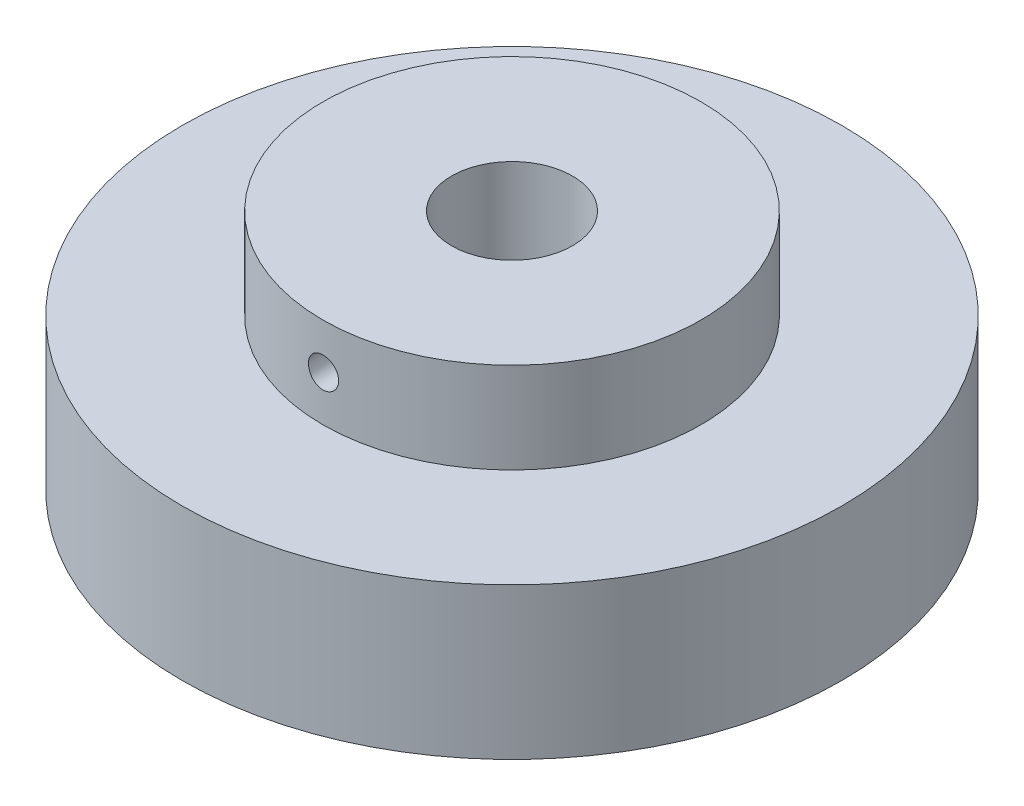
ISO-10303-21;
HEADER;
FILE_DESCRIPTION(('STEP AP214'),'2;1');
FILE_NAME('part.step','',(''),(''),'','','');
FILE_SCHEMA(('AUTOMOTIVE_DESIGN { 1 0 10303 214 1 1 1 1 }'));
ENDSEC;
DATA;
#1=APPLICATION_CONTEXT('core data for automotive mechanical design processes');
#2=APPLICATION_PROTOCOL_DEFINITION('international standard','automotive_design',2000,#1);
#3=PRODUCT_CONTEXT('',#1,'mechanical');
#4=PRODUCT('Part','Part','',(#3));
#5=PRODUCT_RELATED_PRODUCT_CATEGORY('part','',(#4));
#6=PRODUCT_DEFINITION_FORMATION('','',#4);
#7=PRODUCT_DEFINITION_CONTEXT('part definition',#1,'design');
#8=PRODUCT_DEFINITION('design','',#6,#7);
#9=PRODUCT_DEFINITION_SHAPE('','',#8);
#10=(LENGTH_UNIT() NAMED_UNIT(*) SI_UNIT(.MILLI.,.METRE.));
#11=(NAMED_UNIT(*) PLANE_ANGLE_UNIT() SI_UNIT($,.RADIAN.));
#12=(NAMED_UNIT(*) SI_UNIT($,.STERADIAN.) SOLID_ANGLE_UNIT());
#13=UNCERTAINTY_MEASURE_WITH_UNIT(LENGTH_MEASURE(1.E-05),#10,'distance_accuracy_value','');
#14=(GEOMETRIC_REPRESENTATION_CONTEXT(3) GLOBAL_UNCERTAINTY_ASSIGNED_CONTEXT((#13)) GLOBAL_UNIT_ASSIGNED_CONTEXT((#10,
#11,#12)) REPRESENTATION_CONTEXT('',''));
#15=CARTESIAN_POINT('',(0.,0.,0.));
#16=DIRECTION('',(0.,0.,1.));
#17=DIRECTION('',(1.,0.,0.));
#18=AXIS2_PLACEMENT_3D('',#15,#16,#17);
#19=CARTESIAN_POINT('',(0.,10.,0.));
#20=DIRECTION('',(0.,-1.,0.));
#21=DIRECTION('',(0.,0.,-1.));
#22=AXIS2_PLACEMENT_3D('',#19,#20,#21);
#23=CYLINDRICAL_SURFACE('',#22,4.);
#24=CARTESIAN_POINT('',(0.,16.,0.));
#25=DIRECTION('',(0.,1.,0.));
#26=DIRECTION('',(0.,0.,1.));
#27=AXIS2_PLACEMENT_3D('',#24,#25,#26);
#28=CIRCLE('',#27,4.);
#29=CARTESIAN_POINT('',(0.,16.,4.));
#30=VERTEX_POINT('',#29);
#31=EDGE_CURVE('E51',#30,#30,#28,.T.);
#32=ORIENTED_EDGE('',*,*,#31,.T.);
#33=EDGE_LOOP('',(#32));
#34=FACE_BOUND('',#33,.T.);
#35=CARTESIAN_POINT('',(0.,0.,0.));
#36=DIRECTION('',(0.,1.,0.));
#37=DIRECTION('',(0.,0.,1.));
#38=AXIS2_PLACEMENT_3D('',#35,#36,#37);
#39=CIRCLE('',#38,4.);
#40=CARTESIAN_POINT('',(0.,0.,4.));
#41=VERTEX_POINT('',#40);
#42=EDGE_CURVE('E43',#41,#41,#39,.T.);
#43=ORIENTED_EDGE('',*,*,#42,.F.);
#44=EDGE_LOOP('',(#43));
#45=FACE_BOUND('',#44,.T.);
#46=CARTESIAN_POINT('',(-1.,13.,3.87298334620742));
#47=CARTESIAN_POINT('',(-0.999998431438699,13.0552203003568,3.87298440057185));
#48=CARTESIAN_POINT('',(-0.995410498208069,13.1104579594314,3.87417722499278));
#49=CARTESIAN_POINT('',(-0.977209250194446,13.2193470312326,3.87880744892249));
#50=CARTESIAN_POINT('',(-0.963590682698077,13.27299750178,3.8822461547418));
#51=CARTESIAN_POINT('',(-0.927796479849634,13.3771214152878,3.89095489813012));
#52=CARTESIAN_POINT('',(-0.905631891140943,13.4275988621578,3.8962225706936));
#53=CARTESIAN_POINT('',(-0.853408456505406,13.5241243410125,3.90799276818327));
#54=CARTESIAN_POINT('',(-0.823349275424504,13.5701721848311,3.91449534553241));
#55=CARTESIAN_POINT('',(-0.755483370924517,13.6575446581058,3.92816286540368));
#56=CARTESIAN_POINT('',(-0.717534755081557,13.6987574401403,3.93533839048709));
#57=CARTESIAN_POINT('',(-0.635272825640327,13.7743045577439,3.94945150206622));
#58=CARTESIAN_POINT('',(-0.590958917672138,13.8086382502486,3.95638906626691));
#59=CARTESIAN_POINT('',(-0.496458080431563,13.8699101870526,3.96936166208095));
#60=CARTESIAN_POINT('',(-0.446197830478042,13.8967385552646,3.975382749602));
#61=CARTESIAN_POINT('',(-0.341705273717108,13.9415238576612,3.9857232477043));
#62=CARTESIAN_POINT('',(-0.287473554316776,13.9594821007662,3.99004290933747));
#63=CARTESIAN_POINT('',(-0.177743503501662,13.9856591338314,3.99641903539262));
#64=CARTESIAN_POINT('',(-0.122293087819588,13.9940678577306,3.99851957537723));
#65=CARTESIAN_POINT('',(-0.0107315277051066,14.0015033517102,4.00037437642922));
#66=CARTESIAN_POINT('',(0.0453795178152288,14.0005315088838,4.00012898438682));
#67=CARTESIAN_POINT('',(0.155352247172389,13.9893700598999,3.99735237981413));
#68=CARTESIAN_POINT('',(0.209236215601069,13.9793854699785,3.99487200936349));
#69=CARTESIAN_POINT('',(0.314538247413688,13.9508114919806,3.98796334609942));
#70=CARTESIAN_POINT('',(0.36595617937044,13.932221645849,3.98353494959376));
#71=CARTESIAN_POINT('',(0.465406703501808,13.8867989717252,3.97315003880358));
#72=CARTESIAN_POINT('',(0.513404509766506,13.8598931821353,3.96718007878021));
#73=CARTESIAN_POINT('',(0.604275622340491,13.7986577283535,3.9543596152386));
#74=CARTESIAN_POINT('',(0.647148035085507,13.7643267725758,3.94750895860996));
#75=CARTESIAN_POINT('',(0.727774035084958,13.6881165032071,3.93345485507808));
#76=CARTESIAN_POINT('',(0.765357679075201,13.6460580430609,3.92624687810367));
#77=CARTESIAN_POINT('',(0.83297637596302,13.5561600105839,3.91246017406682));
#78=CARTESIAN_POINT('',(0.863011076046018,13.5083201682036,3.90588147642388));
#79=CARTESIAN_POINT('',(0.914788129022599,13.4078839863404,3.89408198732659));
#80=CARTESIAN_POINT('',(0.936489566970492,13.3552657078747,3.88886793490288));
#81=CARTESIAN_POINT('',(0.970685620636342,13.2469658127694,3.88047456055983));
#82=CARTESIAN_POINT('',(0.983182206552911,13.1912848544067,3.87729480324087));
#83=CARTESIAN_POINT('',(0.998331855466072,13.0800161993908,3.87342142415656));
#84=CARTESIAN_POINT('',(1.00123618956785,13.0244648826682,3.87266435637459));
#85=CARTESIAN_POINT('',(0.99780679620622,12.9136712253687,3.87354937392416));
#86=CARTESIAN_POINT('',(0.991473919139521,12.8584288568195,3.87519123840506));
#87=CARTESIAN_POINT('',(0.969970185575066,12.7507542940181,3.88062832781824));
#88=CARTESIAN_POINT('',(0.954945627312699,12.6982909093717,3.8843878809375));
#89=CARTESIAN_POINT('',(0.916647232668249,12.5966274168593,3.89360287308385));
#90=CARTESIAN_POINT('',(0.893372419085019,12.5474276963779,3.89905851299445));
#91=CARTESIAN_POINT('',(0.838708267174623,12.4526234888531,3.91118454837305));
#92=CARTESIAN_POINT('',(0.807168701534252,12.4071084639828,3.91787667442657));
#93=CARTESIAN_POINT('',(0.737060292934456,12.3219246548795,3.93166833228686));
#94=CARTESIAN_POINT('',(0.698490294805439,12.28225683334,3.93876793091388));
#95=CARTESIAN_POINT('',(0.614262720984725,12.2088755829716,3.95278961212643));
#96=CARTESIAN_POINT('',(0.568451952531592,12.1753359749805,3.95970280824734));
#97=CARTESIAN_POINT('',(0.471702682694675,12.1164256532195,3.97238886645494));
#98=CARTESIAN_POINT('',(0.420764448957591,12.0910545133567,3.97816178801584));
#99=CARTESIAN_POINT('',(0.31555820173109,12.0494215861888,3.98788046295326));
#100=CARTESIAN_POINT('',(0.261317381027881,12.0330942862484,3.99183932008964));
#101=CARTESIAN_POINT('',(0.150749760318808,12.0098158661566,3.99754117358315));
#102=CARTESIAN_POINT('',(0.0944233650412435,12.0028629365044,3.99928459757363));
#103=CARTESIAN_POINT('',(-0.0170835264433265,11.9986324104245,4.00034169408811));
#104=CARTESIAN_POINT('',(-0.0722538269660335,12.0010982909046,3.99971978880008));
#105=CARTESIAN_POINT('',(-0.18136749641474,12.0150478272943,3.99625896457423));
#106=CARTESIAN_POINT('',(-0.235310901780887,12.0265312150131,3.99342011157094));
#107=CARTESIAN_POINT('',(-0.340171035644816,12.0580522197709,3.98585432853963));
#108=CARTESIAN_POINT('',(-0.391102494581019,12.0780434533146,3.98113764502669));
#109=CARTESIAN_POINT('',(-0.488917053041468,12.1259705790193,3.97031288913382));
#110=CARTESIAN_POINT('',(-0.53579964126505,12.1539074726696,3.96420464137727));
#111=CARTESIAN_POINT('',(-0.6254019284239,12.2177152339971,3.95107249681342));
#112=CARTESIAN_POINT('',(-0.667994988300587,12.2537601429074,3.94403016945647));
#113=CARTESIAN_POINT('',(-0.746615020271251,12.3324228519738,3.92990649053207));
#114=CARTESIAN_POINT('',(-0.782640325068177,12.3750423160979,3.92282512952424));
#115=CARTESIAN_POINT('',(-0.84776202647924,12.4666014142013,3.90927475860683));
#116=CARTESIAN_POINT('',(-0.876716619446593,12.5156441234125,3.90281963730391));
#117=CARTESIAN_POINT('',(-0.925926896615622,12.6180554899228,3.8914395555011));
#118=CARTESIAN_POINT('',(-0.946188909759556,12.6714209661073,3.88651348244814));
#119=CARTESIAN_POINT('',(-0.974422528565571,12.7705770118263,3.87951908741315));
#120=CARTESIAN_POINT('',(-0.983993170595828,12.8158931643824,3.87708663005761));
#121=CARTESIAN_POINT('',(-0.996782292572819,12.9074688690015,3.87381838580358));
#122=CARTESIAN_POINT('',(-1.00000131437052,12.9537283402506,3.87298246270639));
#123=CARTESIAN_POINT('',(-1.,13.,3.87298334620742));
#124=B_SPLINE_CURVE_WITH_KNOTS('',3,(#46,#47,#48,#49,#50,#51,#52,#53,#54,#55,#56,#57,#58,#59,
#60,#61,#62,#63,#64,#65,#66,#67,#68,#69,#70,#71,#72,#73,#74,#75,#76,#77,#78,#79,#80,#81,#82,#83,
#84,#85,#86,#87,#88,#89,#90,#91,#92,#93,#94,#95,#96,#97,#98,#99,#100,#101,#102,#103,#104,#105,
#106,#107,#108,#109,#110,#111,#112,#113,#114,#115,#116,#117,#118,#119,#120,#121,#122,#123),
.UNSPECIFIED.,.T.,.F.,(4,2,2,2,2,2,2,2,2,2,2,2,2,2,2,2,2,2,2,2,2,2,2,2,2,2,2,2,2,2,2,2,2,2,2,2,
2,2,4),(0.,0.165490976675229,0.331078296534212,0.496452290829155,0.661833306984659,
0.830495816734651,0.999174085882213,1.17020598555443,1.34121263935112,1.50875500394413,
1.67627259462683,1.84007305071853,2.00388222686189,2.16917149698052,2.3344895418384,
2.50428186625039,2.67408212476196,2.84470572799636,3.01529280048094,3.18137429900961,
3.34744050869795,3.51078961999957,3.67415808564842,3.84073138339938,4.00733207550293,
4.17810132382402,4.34886166284096,4.51836829119046,4.6878421955989,4.85273378447257,
5.01762046947067,5.18161950620159,5.34563922291504,5.51358838629103,5.68158012622478,
5.85270590910146,6.02370688542923,6.16239130867207,6.30106390036083),.UNSPECIFIED.);
#125=CARTESIAN_POINT('',(-1.,13.,3.87298334620742));
#126=VERTEX_POINT('',#125);
#127=EDGE_CURVE('E56',#126,#126,#124,.T.);
#128=ORIENTED_EDGE('',*,*,#127,.F.);
#129=EDGE_LOOP('',(#128));
#130=FACE_BOUND('',#129,.T.);
#131=ADVANCED_FACE('F32',(#34,#45,#130),#23,.F.);
#132=CARTESIAN_POINT('',(0.,16.,0.));
#133=DIRECTION('',(0.,-1.,0.));
#134=DIRECTION('',(0.,0.,-1.));
#135=AXIS2_PLACEMENT_3D('',#132,#133,#134);
#136=CYLINDRICAL_SURFACE('',#135,12.5);
#137=CARTESIAN_POINT('',(0.,16.,0.));
#138=DIRECTION('',(0.,1.,0.));
#139=DIRECTION('',(0.,0.,1.));
#140=AXIS2_PLACEMENT_3D('',#137,#138,#139);
#141=CIRCLE('',#140,12.5);
#142=CARTESIAN_POINT('',(0.,16.,12.5));
#143=VERTEX_POINT('',#142);
#144=EDGE_CURVE('E47',#143,#143,#141,.T.);
#145=ORIENTED_EDGE('',*,*,#144,.F.);
#146=EDGE_LOOP('',(#145));
#147=FACE_BOUND('',#146,.T.);
#148=CARTESIAN_POINT('',(0.,10.,0.));
#149=DIRECTION('',(0.,1.,0.));
#150=DIRECTION('',(0.,0.,1.));
#151=AXIS2_PLACEMENT_3D('',#148,#149,#150);
#152=CIRCLE('',#151,12.5);
#153=CARTESIAN_POINT('',(0.,10.,12.5));
#154=VERTEX_POINT('',#153);
#155=EDGE_CURVE('E48',#154,#154,#152,.T.);
#156=ORIENTED_EDGE('',*,*,#155,.T.);
#157=EDGE_LOOP('',(#156));
#158=FACE_BOUND('',#157,.T.);
#159=CARTESIAN_POINT('',(-1.,13.,12.4599357943771));
#160=CARTESIAN_POINT('',(-0.999997547085149,13.0560739268371,12.4599363261343));
#161=CARTESIAN_POINT('',(-0.99526770810122,13.1121862231959,12.4603183961439));
#162=CARTESIAN_POINT('',(-0.976468791829239,13.2228588282076,12.4618054137856));
#163=CARTESIAN_POINT('',(-0.962389080727772,13.2774172958904,12.4629111844775));
#164=CARTESIAN_POINT('',(-0.925299726825745,13.383363279089,12.4657195634804));
#165=CARTESIAN_POINT('',(-0.902295084095044,13.4347525514529,12.4674218375571));
#166=CARTESIAN_POINT('',(-0.848017640285548,13.5329278538277,12.4712310003334));
#167=CARTESIAN_POINT('',(-0.816746629291101,13.5797148774507,12.4733378014056));
#168=CARTESIAN_POINT('',(-0.74674367887659,13.6674812055411,12.4777242610877));
#169=CARTESIAN_POINT('',(-0.707996166220319,13.7084480720834,12.4800042743739));
#170=CARTESIAN_POINT('',(-0.624172963840228,13.783304390266,12.4844770022604));
#171=CARTESIAN_POINT('',(-0.579097000058929,13.817193535243,12.4866697130747));
#172=CARTESIAN_POINT('',(-0.483822778983963,13.8769733835151,12.4907240968905));
#173=CARTESIAN_POINT('',(-0.433617787770056,13.9028533873116,12.4925853256653));
#174=CARTESIAN_POINT('',(-0.329557660725922,13.9458118703316,12.4957632239194));
#175=CARTESIAN_POINT('',(-0.275702584344853,13.9628904928649,12.4970799022654));
#176=CARTESIAN_POINT('',(-0.165994330507245,13.9877257815978,12.4990178703125));
#177=CARTESIAN_POINT('',(-0.110145716834904,13.9955024895264,12.4996406548649));
#178=CARTESIAN_POINT('',(0.002067342816816,14.001575141682,12.5001257253456));
#179=CARTESIAN_POINT('',(0.058431779862693,13.9998712497938,12.4999880244198));
#180=CARTESIAN_POINT('',(0.169940639230496,13.9870474838924,12.4989688748124));
#181=CARTESIAN_POINT('',(0.225087557880393,13.9759491625558,12.4980891285457));
#182=CARTESIAN_POINT('',(0.332733300126543,13.9446850791399,12.4956868144922));
#183=CARTESIAN_POINT('',(0.385232100203442,13.9245192365429,12.4941642409973));
#184=CARTESIAN_POINT('',(0.486160050419076,13.8756684547855,12.4906446582092));
#185=CARTESIAN_POINT('',(0.534584499110234,13.8469738425637,12.4886471107328));
#186=CARTESIAN_POINT('',(0.625937836259756,13.7818870812453,12.4844021206022));
#187=CARTESIAN_POINT('',(0.668866622101125,13.7454947884485,12.4821546732831));
#188=CARTESIAN_POINT('',(0.7481360194847,13.6659241918689,12.4776550925567));
#189=CARTESIAN_POINT('',(0.784457838650309,13.6227271639661,12.4754029636585));
#190=CARTESIAN_POINT('',(0.849337126944276,13.5308386167321,12.4711541938614));
#191=CARTESIAN_POINT('',(0.877894590376295,13.4821470933698,12.4691575531499));
#192=CARTESIAN_POINT('',(0.926433699094363,13.3806387571377,12.4656454222996));
#193=CARTESIAN_POINT('',(0.946414402057072,13.3278214917284,12.4641299850351));
#194=CARTESIAN_POINT('',(0.977219066595046,13.2195671072457,12.4617528334957));
#195=CARTESIAN_POINT('',(0.988043205396477,13.1641300389008,12.4608911065682));
#196=CARTESIAN_POINT('',(1.00020376185753,13.0523740517523,12.459920958717));
#197=CARTESIAN_POINT('',(1.00156637071972,12.9960580001886,12.4598104582821));
#198=CARTESIAN_POINT('',(0.99483376390115,12.8839982526358,12.4603497841393));
#199=CARTESIAN_POINT('',(0.986738629421386,12.8282545517368,12.4609996039037));
#200=CARTESIAN_POINT('',(0.961342147760121,12.7189968526572,12.4629844534383));
#201=CARTESIAN_POINT('',(0.944052994644963,12.6654800021321,12.4643185755325));
#202=CARTESIAN_POINT('',(0.900771639268654,12.5621068505762,12.4675209489402));
#203=CARTESIAN_POINT('',(0.87477930814321,12.5122506037598,12.4693892081624));
#204=CARTESIAN_POINT('',(0.814763031379769,12.417493960358,12.473454388194));
#205=CARTESIAN_POINT('',(0.78072161521052,12.3726046600932,12.4756520200531));
#206=CARTESIAN_POINT('',(0.705598745600101,12.2891682347252,12.4801259038523));
#207=CARTESIAN_POINT('',(0.664517180422414,12.2506212103014,12.4824021570399));
#208=CARTESIAN_POINT('',(0.576367068175726,12.1808743116622,12.4867829773348));
#209=CARTESIAN_POINT('',(0.529285043502099,12.1496914423173,12.4888871398827));
#210=CARTESIAN_POINT('',(0.430537760510538,12.0956746400523,12.4926808690718));
#211=CARTESIAN_POINT('',(0.37887254490184,12.072840629342,12.494370439576));
#212=CARTESIAN_POINT('',(0.272486681653454,12.0361989896735,12.4971427432508));
#213=CARTESIAN_POINT('',(0.21776969019107,12.0223808011712,12.4982261861197));
#214=CARTESIAN_POINT('',(0.106783222479464,12.0041285333121,12.4996670332512));
#215=CARTESIAN_POINT('',(0.050513773100703,11.9996942916378,12.5000244500722));
#216=CARTESIAN_POINT('',(-0.0618125911014048,12.0003376183868,12.4999729971288));
#217=CARTESIAN_POINT('',(-0.117869660706123,12.0053886662784,12.4995662638991));
#218=CARTESIAN_POINT('',(-0.228336699550509,12.0248039431074,12.4980364442858));
#219=CARTESIAN_POINT('',(-0.282746666414,12.0391681854797,12.4969133568687));
#220=CARTESIAN_POINT('',(-0.388377092632293,12.0767954825878,12.4940768776102));
#221=CARTESIAN_POINT('',(-0.439597701732266,12.1000581191638,12.4923635135078));
#222=CARTESIAN_POINT('',(-0.537410622847658,12.1548187523146,12.4885382863701));
#223=CARTESIAN_POINT('',(-0.5840030163588,12.1863166038446,12.4864264303535));
#224=CARTESIAN_POINT('',(-0.671372532574257,12.256753001422,12.4820343204354));
#225=CARTESIAN_POINT('',(-0.712133848623562,12.2957111268853,12.4797536333215));
#226=CARTESIAN_POINT('',(-0.786554832131109,12.3799278052271,12.4752845802424));
#227=CARTESIAN_POINT('',(-0.820212774228543,12.4251878843861,12.47309623681));
#228=CARTESIAN_POINT('',(-0.879513364136057,12.5208049672445,12.4690554560098));
#229=CARTESIAN_POINT('',(-0.905141817385163,12.5711707912465,12.4672036159134));
#230=CARTESIAN_POINT('',(-0.94754570133519,12.6754707482134,12.4640528500999));
#231=CARTESIAN_POINT('',(-0.964331344547328,12.7294006836003,12.4627532868983));
#232=CARTESIAN_POINT('',(-0.984282253054409,12.8197091320412,12.4611895849074));
#233=CARTESIAN_POINT('',(-0.990168611551805,12.8555062676392,12.4607215639363));
#234=CARTESIAN_POINT('',(-0.998028272959502,12.927530259814,12.4600944971999));
#235=CARTESIAN_POINT('',(-1.00000158541973,12.9637571153419,12.4599354506806));
#236=CARTESIAN_POINT('',(-1.,13.,12.4599357943771));
#237=B_SPLINE_CURVE_WITH_KNOTS('',3,(#159,#160,#161,#162,#163,#164,#165,#166,#167,#168,#169,
#170,#171,#172,#173,#174,#175,#176,#177,#178,#179,#180,#181,#182,#183,#184,#185,#186,#187,#188,
#189,#190,#191,#192,#193,#194,#195,#196,#197,#198,#199,#200,#201,#202,#203,#204,#205,#206,#207,
#208,#209,#210,#211,#212,#213,#214,#215,#216,#217,#218,#219,#220,#221,#222,#223,#224,#225,#226,
#227,#228,#229,#230,#231,#232,#233,#234,#235,#236),.UNSPECIFIED.,.T.,.F.,(4,2,2,2,2,2,2,2,2,2,2,
2,2,2,2,2,2,2,2,2,2,2,2,2,2,2,2,2,2,2,2,2,2,2,2,2,2,2,4),(0.,0.168089454691941,
0.336370409349234,0.504557222747152,0.672707645037223,0.84121217411268,1.00972400263285,
1.178459985731,1.34719322127611,1.51556224873124,1.68392836571454,1.85190926120529,
2.01989164836149,2.18806528760008,2.35624206657957,2.52488996039299,2.693537977935,
2.86220451999013,3.03086779741371,3.19906399800308,3.36725875452733,3.53523098797079,
3.70320570861837,3.87154842028779,4.03989380402717,4.2086242008813,4.37735302555796,
4.5458838746034,4.71441180848818,4.88246924571035,5.05052692536747,5.21857670850331,
5.38662353201745,5.55511759193959,5.72365253093074,5.89248374712536,6.06111955127103,
6.16976294277556,6.2784060691317),.UNSPECIFIED.);
#238=CARTESIAN_POINT('',(-1.,13.,12.4599357943771));
#239=VERTEX_POINT('',#238);
#240=EDGE_CURVE('E64',#239,#239,#237,.T.);
#241=ORIENTED_EDGE('',*,*,#240,.T.);
#242=EDGE_LOOP('',(#241));
#243=FACE_BOUND('',#242,.T.);
#244=ADVANCED_FACE('F81',(#147,#158,#243),#136,.T.);
#245=CARTESIAN_POINT('',(0.,10.,0.));
#246=DIRECTION('',(0.,1.,0.));
#247=DIRECTION('',(0.,0.,1.));
#248=AXIS2_PLACEMENT_3D('',#245,#246,#247);
#249=PLANE('',#248);
#250=CARTESIAN_POINT('',(0.,10.,0.));
#251=DIRECTION('',(0.,1.,0.));
#252=DIRECTION('',(0.,0.,1.));
#253=AXIS2_PLACEMENT_3D('',#250,#251,#252);
#254=CIRCLE('',#253,21.8);
#255=CARTESIAN_POINT('',(0.,10.,21.8));
#256=VERTEX_POINT('',#255);
#257=EDGE_CURVE('E10',#256,#256,#254,.T.);
#258=ORIENTED_EDGE('',*,*,#257,.T.);
#259=EDGE_LOOP('',(#258));
#260=FACE_BOUND('',#259,.T.);
#261=ORIENTED_EDGE('',*,*,#155,.F.);
#262=EDGE_LOOP('',(#261));
#263=FACE_BOUND('',#262,.T.);
#264=ADVANCED_FACE('F84',(#260,#263),#249,.T.);
#265=CARTESIAN_POINT('',(0.,0.,0.));
#266=DIRECTION('',(0.,1.,0.));
#267=DIRECTION('',(0.,0.,1.));
#268=AXIS2_PLACEMENT_3D('',#265,#266,#267);
#269=PLANE('',#268);
#270=CARTESIAN_POINT('',(0.,0.,0.));
#271=DIRECTION('',(0.,1.,0.));
#272=DIRECTION('',(0.,0.,1.));
#273=AXIS2_PLACEMENT_3D('',#270,#271,#272);
#274=CIRCLE('',#273,21.8);
#275=CARTESIAN_POINT('',(0.,0.,21.8));
#276=VERTEX_POINT('',#275);
#277=EDGE_CURVE('E36',#276,#276,#274,.T.);
#278=ORIENTED_EDGE('',*,*,#277,.F.);
#279=EDGE_LOOP('',(#278));
#280=FACE_BOUND('',#279,.T.);
#281=ORIENTED_EDGE('',*,*,#42,.T.);
#282=EDGE_LOOP('',(#281));
#283=FACE_BOUND('',#282,.T.);
#284=ADVANCED_FACE('F90',(#280,#283),#269,.F.);
#285=CARTESIAN_POINT('',(0.,10.,0.));
#286=DIRECTION('',(0.,-1.,0.));
#287=DIRECTION('',(0.,0.,-1.));
#288=AXIS2_PLACEMENT_3D('',#285,#286,#287);
#289=CYLINDRICAL_SURFACE('',#288,21.8);
#290=ORIENTED_EDGE('',*,*,#257,.F.);
#291=EDGE_LOOP('',(#290));
#292=FACE_BOUND('',#291,.T.);
#293=ORIENTED_EDGE('',*,*,#277,.T.);
#294=EDGE_LOOP('',(#293));
#295=FACE_BOUND('',#294,.T.);
#296=ADVANCED_FACE('F34',(#292,#295),#289,.T.);
#297=CARTESIAN_POINT('',(0.,16.,0.));
#298=DIRECTION('',(0.,1.,0.));
#299=DIRECTION('',(0.,0.,1.));
#300=AXIS2_PLACEMENT_3D('',#297,#298,#299);
#301=PLANE('',#300);
#302=ORIENTED_EDGE('',*,*,#144,.T.);
#303=EDGE_LOOP('',(#302));
#304=FACE_BOUND('',#303,.T.);
#305=ORIENTED_EDGE('',*,*,#31,.F.);
#306=EDGE_LOOP('',(#305));
#307=FACE_BOUND('',#306,.T.);
#308=ADVANCED_FACE('F75',(#304,#307),#301,.T.);
#309=CARTESIAN_POINT('',(0.,13.,21.801));
#310=DIRECTION('',(0.,0.,-1.));
#311=DIRECTION('',(-1.,0.,0.));
#312=AXIS2_PLACEMENT_3D('',#309,#310,#311);
#313=CYLINDRICAL_SURFACE('',#312,1.);
#314=ORIENTED_EDGE('',*,*,#127,.T.);
#315=EDGE_LOOP('',(#314));
#316=FACE_BOUND('',#315,.T.);
#317=ORIENTED_EDGE('',*,*,#240,.F.);
#318=EDGE_LOOP('',(#317));
#319=FACE_BOUND('',#318,.T.);
#320=ADVANCED_FACE('F69',(#316,#319),#313,.F.);
#321=CLOSED_SHELL('',(#131,#244,#264,#284,#296,#308,#320));
#322=MANIFOLD_SOLID_BREP('B2',#321);
#323=ADVANCED_BREP_SHAPE_REPRESENTATION('',(#18,#322),#14);
#324=SHAPE_DEFINITION_REPRESENTATION(#9,#323);
ENDSEC;
END-ISO-10303-21;
